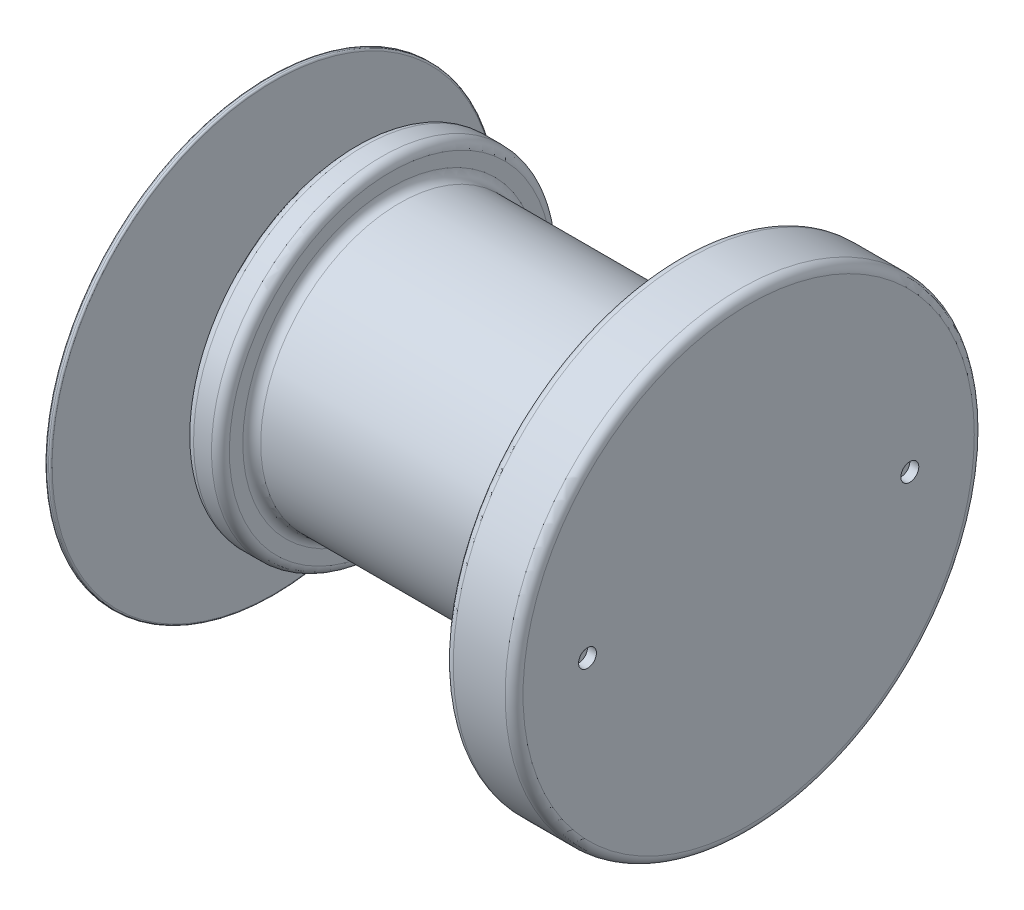
ISO-10303-21;
HEADER;
FILE_DESCRIPTION(('STEP AP214'),'2;1');
FILE_NAME('part.step','',(''),(''),'','','');
FILE_SCHEMA(('AUTOMOTIVE_DESIGN { 1 0 10303 214 1 1 1 1 }'));
ENDSEC;
DATA;
#1=APPLICATION_CONTEXT('core data for automotive mechanical design processes');
#2=APPLICATION_PROTOCOL_DEFINITION('international standard','automotive_design',2000,#1);
#3=PRODUCT_CONTEXT('',#1,'mechanical');
#4=PRODUCT('Part','Part','',(#3));
#5=PRODUCT_RELATED_PRODUCT_CATEGORY('part','',(#4));
#6=PRODUCT_DEFINITION_FORMATION('','',#4);
#7=PRODUCT_DEFINITION_CONTEXT('part definition',#1,'design');
#8=PRODUCT_DEFINITION('design','',#6,#7);
#9=PRODUCT_DEFINITION_SHAPE('','',#8);
#10=(LENGTH_UNIT() NAMED_UNIT(*) SI_UNIT(.MILLI.,.METRE.));
#11=(NAMED_UNIT(*) PLANE_ANGLE_UNIT() SI_UNIT($,.RADIAN.));
#12=(NAMED_UNIT(*) SI_UNIT($,.STERADIAN.) SOLID_ANGLE_UNIT());
#13=UNCERTAINTY_MEASURE_WITH_UNIT(LENGTH_MEASURE(1.E-05),#10,'distance_accuracy_value','');
#14=(GEOMETRIC_REPRESENTATION_CONTEXT(3) GLOBAL_UNCERTAINTY_ASSIGNED_CONTEXT((#13)) GLOBAL_UNIT_ASSIGNED_CONTEXT((#10,
#11,#12)) REPRESENTATION_CONTEXT('',''));
#15=CARTESIAN_POINT('',(0.,0.,0.));
#16=DIRECTION('',(0.,0.,1.));
#17=DIRECTION('',(1.,0.,0.));
#18=AXIS2_PLACEMENT_3D('',#15,#16,#17);
#19=CARTESIAN_POINT('',(-248.,-22.5,0.));
#20=DIRECTION('',(1.,0.,0.));
#21=DIRECTION('',(0.,1.,0.));
#22=AXIS2_PLACEMENT_3D('',#19,#20,#21);
#23=CYLINDRICAL_SURFACE('',#22,6.);
#24=CARTESIAN_POINT('',(-229.,-22.5,0.));
#25=DIRECTION('',(-1.,0.,0.));
#26=DIRECTION('',(0.,-1.,0.));
#27=AXIS2_PLACEMENT_3D('',#24,#25,#26);
#28=CIRCLE('',#27,6.);
#29=CARTESIAN_POINT('',(-229.,-28.5,0.));
#30=VERTEX_POINT('',#29);
#31=EDGE_CURVE('E103',#30,#30,#28,.T.);
#32=ORIENTED_EDGE('',*,*,#31,.T.);
#33=EDGE_LOOP('',(#32));
#34=FACE_BOUND('',#33,.T.);
#35=CARTESIAN_POINT('',(-238.,-22.5,0.));
#36=DIRECTION('',(-1.,0.,0.));
#37=DIRECTION('',(0.,-1.,0.));
#38=AXIS2_PLACEMENT_3D('',#35,#36,#37);
#39=CIRCLE('',#38,6.);
#40=CARTESIAN_POINT('',(-238.,-28.5,0.));
#41=VERTEX_POINT('',#40);
#42=EDGE_CURVE('E99',#41,#41,#39,.T.);
#43=ORIENTED_EDGE('',*,*,#42,.F.);
#44=EDGE_LOOP('',(#43));
#45=FACE_BOUND('',#44,.T.);
#46=ADVANCED_FACE('F31',(#34,#45),#23,.T.);
#47=CARTESIAN_POINT('',(-181.,0.,0.));
#48=DIRECTION('',(1.,0.,0.));
#49=DIRECTION('',(0.,1.,0.));
#50=AXIS2_PLACEMENT_3D('',#47,#48,#49);
#51=CYLINDRICAL_SURFACE('',#50,77.5);
#52=CARTESIAN_POINT('',(-156.,0.,0.));
#53=DIRECTION('',(-1.,0.,0.));
#54=DIRECTION('',(0.,-1.,0.));
#55=AXIS2_PLACEMENT_3D('',#52,#53,#54);
#56=CIRCLE('',#55,77.5);
#57=CARTESIAN_POINT('',(-156.,-77.5,0.));
#58=VERTEX_POINT('',#57);
#59=EDGE_CURVE('E46',#58,#58,#56,.F.);
#60=ORIENTED_EDGE('',*,*,#59,.T.);
#61=EDGE_LOOP('',(#60));
#62=FACE_BOUND('',#61,.T.);
#63=CARTESIAN_POINT('',(-5.,0.,0.));
#64=DIRECTION('',(1.,0.,0.));
#65=DIRECTION('',(0.,0.,-1.));
#66=AXIS2_PLACEMENT_3D('',#63,#64,#65);
#67=CIRCLE('',#66,77.5);
#68=CARTESIAN_POINT('',(-5.,0.,-77.5));
#69=VERTEX_POINT('',#68);
#70=EDGE_CURVE('E51',#69,#69,#67,.F.);
#71=ORIENTED_EDGE('',*,*,#70,.T.);
#72=EDGE_LOOP('',(#71));
#73=FACE_BOUND('',#72,.T.);
#74=ADVANCED_FACE('F159',(#62,#73),#51,.T.);
#75=CARTESIAN_POINT('',(0.,0.,0.));
#76=DIRECTION('',(1.,0.,0.));
#77=DIRECTION('',(0.,0.,-1.));
#78=AXIS2_PLACEMENT_3D('',#75,#76,#77);
#79=PLANE('',#78);
#80=CARTESIAN_POINT('',(0.,0.,0.));
#81=DIRECTION('',(1.,0.,0.));
#82=DIRECTION('',(0.,0.,-1.));
#83=AXIS2_PLACEMENT_3D('',#80,#81,#82);
#84=CIRCLE('',#83,126.);
#85=CARTESIAN_POINT('',(0.,0.,-126.));
#86=VERTEX_POINT('',#85);
#87=EDGE_CURVE('E60',#86,#86,#84,.F.);
#88=ORIENTED_EDGE('',*,*,#87,.T.);
#89=EDGE_LOOP('',(#88));
#90=FACE_BOUND('',#89,.T.);
#91=CARTESIAN_POINT('',(0.,0.,0.));
#92=DIRECTION('',(1.,0.,0.));
#93=DIRECTION('',(0.,0.,-1.));
#94=AXIS2_PLACEMENT_3D('',#91,#92,#93);
#95=CIRCLE('',#94,82.5);
#96=CARTESIAN_POINT('',(0.,0.,-82.5));
#97=VERTEX_POINT('',#96);
#98=EDGE_CURVE('E63',#97,#97,#95,.T.);
#99=ORIENTED_EDGE('',*,*,#98,.T.);
#100=EDGE_LOOP('',(#99));
#101=FACE_BOUND('',#100,.T.);
#102=ADVANCED_FACE('F165',(#90,#101),#79,.F.);
#103=CARTESIAN_POINT('',(39.,0.,0.));
#104=DIRECTION('',(-1.,0.,0.));
#105=DIRECTION('',(0.,0.,1.));
#106=AXIS2_PLACEMENT_3D('',#103,#104,#105);
#107=CYLINDRICAL_SURFACE('',#106,131.);
#108=CARTESIAN_POINT('',(34.,0.,0.));
#109=DIRECTION('',(1.,0.,0.));
#110=DIRECTION('',(0.,0.,-1.));
#111=AXIS2_PLACEMENT_3D('',#108,#109,#110);
#112=CIRCLE('',#111,131.);
#113=CARTESIAN_POINT('',(34.,0.,-131.));
#114=VERTEX_POINT('',#113);
#115=EDGE_CURVE('E66',#114,#114,#112,.F.);
#116=ORIENTED_EDGE('',*,*,#115,.T.);
#117=EDGE_LOOP('',(#116));
#118=FACE_BOUND('',#117,.T.);
#119=CARTESIAN_POINT('',(5.,0.,0.));
#120=DIRECTION('',(1.,0.,0.));
#121=DIRECTION('',(0.,0.,-1.));
#122=AXIS2_PLACEMENT_3D('',#119,#120,#121);
#123=CIRCLE('',#122,131.);
#124=CARTESIAN_POINT('',(5.,0.,-131.));
#125=VERTEX_POINT('',#124);
#126=EDGE_CURVE('E69',#125,#125,#123,.T.);
#127=ORIENTED_EDGE('',*,*,#126,.T.);
#128=EDGE_LOOP('',(#127));
#129=FACE_BOUND('',#128,.T.);
#130=ADVANCED_FACE('F137',(#118,#129),#107,.T.);
#131=CARTESIAN_POINT('',(39.,0.,0.));
#132=DIRECTION('',(1.,0.,0.));
#133=DIRECTION('',(0.,0.,-1.));
#134=AXIS2_PLACEMENT_3D('',#131,#132,#133);
#135=PLANE('',#134);
#136=CARTESIAN_POINT('',(39.,0.,0.));
#137=DIRECTION('',(1.,0.,0.));
#138=DIRECTION('',(0.,0.,-1.));
#139=AXIS2_PLACEMENT_3D('',#136,#137,#138);
#140=CIRCLE('',#139,126.);
#141=CARTESIAN_POINT('',(39.,0.,-126.));
#142=VERTEX_POINT('',#141);
#143=EDGE_CURVE('E72',#142,#142,#140,.T.);
#144=ORIENTED_EDGE('',*,*,#143,.T.);
#145=EDGE_LOOP('',(#144));
#146=FACE_BOUND('',#145,.T.);
#147=CARTESIAN_POINT('',(39.,0.,90.));
#148=DIRECTION('',(1.,0.,0.));
#149=DIRECTION('',(0.,1.,0.));
#150=AXIS2_PLACEMENT_3D('',#147,#148,#149);
#151=CIRCLE('',#150,5.00000000000001);
#152=CARTESIAN_POINT('',(39.,5.00000000000001,90.));
#153=VERTEX_POINT('',#152);
#154=EDGE_CURVE('E118',#153,#153,#151,.T.);
#155=ORIENTED_EDGE('',*,*,#154,.F.);
#156=EDGE_LOOP('',(#155));
#157=FACE_BOUND('',#156,.T.);
#158=CARTESIAN_POINT('',(39.,0.,-90.));
#159=DIRECTION('',(1.,0.,0.));
#160=DIRECTION('',(0.,1.,0.));
#161=AXIS2_PLACEMENT_3D('',#158,#159,#160);
#162=CIRCLE('',#161,5.);
#163=CARTESIAN_POINT('',(39.,5.,-90.));
#164=VERTEX_POINT('',#163);
#165=EDGE_CURVE('E112',#164,#164,#162,.T.);
#166=ORIENTED_EDGE('',*,*,#165,.F.);
#167=EDGE_LOOP('',(#166));
#168=FACE_BOUND('',#167,.T.);
#169=ADVANCED_FACE('F133',(#146,#157,#168),#135,.T.);
#170=CARTESIAN_POINT('',(-161.,0.,0.));
#171=DIRECTION('',(-1.,0.,0.));
#172=DIRECTION('',(0.,-1.,0.));
#173=AXIS2_PLACEMENT_3D('',#170,#171,#172);
#174=PLANE('',#173);
#175=CARTESIAN_POINT('',(-161.,0.,0.));
#176=DIRECTION('',(-1.,0.,0.));
#177=DIRECTION('',(0.,-1.,0.));
#178=AXIS2_PLACEMENT_3D('',#175,#176,#177);
#179=CIRCLE('',#178,82.5);
#180=CARTESIAN_POINT('',(-161.,-82.5,0.));
#181=VERTEX_POINT('',#180);
#182=EDGE_CURVE('E54',#181,#181,#179,.T.);
#183=ORIENTED_EDGE('',*,*,#182,.T.);
#184=EDGE_LOOP('',(#183));
#185=FACE_BOUND('',#184,.T.);
#186=CARTESIAN_POINT('',(-161.,0.,0.));
#187=DIRECTION('',(-1.,0.,0.));
#188=DIRECTION('',(0.,-1.,0.));
#189=AXIS2_PLACEMENT_3D('',#186,#187,#188);
#190=CIRCLE('',#189,90.);
#191=CARTESIAN_POINT('',(-161.,-90.,0.));
#192=VERTEX_POINT('',#191);
#193=EDGE_CURVE('E57',#192,#192,#190,.F.);
#194=ORIENTED_EDGE('',*,*,#193,.T.);
#195=EDGE_LOOP('',(#194));
#196=FACE_BOUND('',#195,.T.);
#197=ADVANCED_FACE('F136',(#185,#196),#174,.F.);
#198=CARTESIAN_POINT('',(-161.,0.,0.));
#199=DIRECTION('',(-1.,0.,0.));
#200=DIRECTION('',(0.,-1.,0.));
#201=AXIS2_PLACEMENT_3D('',#198,#199,#200);
#202=CYLINDRICAL_SURFACE('',#201,95.);
#203=CARTESIAN_POINT('',(-166.,0.,0.));
#204=DIRECTION('',(-1.,0.,0.));
#205=DIRECTION('',(0.,-1.,0.));
#206=AXIS2_PLACEMENT_3D('',#203,#204,#205);
#207=CIRCLE('',#206,95.);
#208=CARTESIAN_POINT('',(-166.,-95.,0.));
#209=VERTEX_POINT('',#208);
#210=EDGE_CURVE('E38',#209,#209,#207,.T.);
#211=ORIENTED_EDGE('',*,*,#210,.T.);
#212=EDGE_LOOP('',(#211));
#213=FACE_BOUND('',#212,.T.);
#214=CARTESIAN_POINT('',(-176.,0.,0.));
#215=DIRECTION('',(-1.,0.,0.));
#216=DIRECTION('',(0.,-1.,0.));
#217=AXIS2_PLACEMENT_3D('',#214,#215,#216);
#218=CIRCLE('',#217,95.);
#219=CARTESIAN_POINT('',(-176.,-95.,0.));
#220=VERTEX_POINT('',#219);
#221=EDGE_CURVE('E42',#220,#220,#218,.F.);
#222=ORIENTED_EDGE('',*,*,#221,.T.);
#223=EDGE_LOOP('',(#222));
#224=FACE_BOUND('',#223,.T.);
#225=ADVANCED_FACE('F173',(#213,#224),#202,.T.);
#226=CARTESIAN_POINT('',(-226.,-22.5,0.));
#227=DIRECTION('',(1.,0.,0.));
#228=DIRECTION('',(0.,1.,0.));
#229=AXIS2_PLACEMENT_3D('',#226,#227,#228);
#230=CYLINDRICAL_SURFACE('',#229,20.);
#231=CARTESIAN_POINT('',(-226.,-22.5,0.));
#232=DIRECTION('',(-1.,0.,0.));
#233=DIRECTION('',(0.,-1.,0.));
#234=AXIS2_PLACEMENT_3D('',#231,#232,#233);
#235=CIRCLE('',#234,20.);
#236=CARTESIAN_POINT('',(-226.,-2.50000000000002,0.));
#237=VERTEX_POINT('',#236);
#238=EDGE_CURVE('E102',#237,#237,#235,.T.);
#239=CARTESIAN_POINT('',(-181.,-22.5,0.));
#240=DIRECTION('',(-1.,0.,0.));
#241=DIRECTION('',(0.,-1.,0.));
#242=AXIS2_PLACEMENT_3D('',#239,#240,#241);
#243=CIRCLE('',#242,20.);
#244=CARTESIAN_POINT('',(-181.,-2.50000000000001,0.));
#245=VERTEX_POINT('',#244);
#246=EDGE_CURVE('E106',#245,#245,#243,.T.);
#247=CARTESIAN_POINT('',(-226.,-2.50000000000002,0.));
#248=CARTESIAN_POINT('',(-225.53125,-2.50000000000002,0.));
#249=CARTESIAN_POINT('',(-225.0625,-2.50000000000002,0.));
#250=CARTESIAN_POINT('',(-224.125,-2.50000000000002,0.));
#251=CARTESIAN_POINT('',(-223.65625,-2.50000000000002,0.));
#252=CARTESIAN_POINT('',(-222.71875,-2.50000000000002,0.));
#253=CARTESIAN_POINT('',(-222.25,-2.50000000000002,0.));
#254=CARTESIAN_POINT('',(-221.3125,-2.50000000000002,0.));
#255=CARTESIAN_POINT('',(-220.84375,-2.50000000000002,0.));
#256=CARTESIAN_POINT('',(-219.90625,-2.50000000000002,0.));
#257=CARTESIAN_POINT('',(-219.4375,-2.50000000000002,0.));
#258=CARTESIAN_POINT('',(-218.5,-2.50000000000002,0.));
#259=CARTESIAN_POINT('',(-218.03125,-2.50000000000002,0.));
#260=CARTESIAN_POINT('',(-217.09375,-2.50000000000002,0.));
#261=CARTESIAN_POINT('',(-216.625,-2.50000000000002,0.));
#262=CARTESIAN_POINT('',(-215.6875,-2.50000000000002,0.));
#263=CARTESIAN_POINT('',(-215.21875,-2.50000000000002,0.));
#264=CARTESIAN_POINT('',(-214.28125,-2.50000000000002,0.));
#265=CARTESIAN_POINT('',(-213.8125,-2.50000000000002,0.));
#266=CARTESIAN_POINT('',(-212.875,-2.50000000000002,0.));
#267=CARTESIAN_POINT('',(-212.40625,-2.50000000000002,0.));
#268=CARTESIAN_POINT('',(-211.46875,-2.50000000000002,0.));
#269=CARTESIAN_POINT('',(-211.,-2.50000000000002,0.));
#270=CARTESIAN_POINT('',(-210.0625,-2.50000000000002,0.));
#271=CARTESIAN_POINT('',(-209.59375,-2.50000000000002,0.));
#272=CARTESIAN_POINT('',(-208.65625,-2.50000000000002,0.));
#273=CARTESIAN_POINT('',(-208.1875,-2.50000000000001,0.));
#274=CARTESIAN_POINT('',(-207.25,-2.50000000000001,0.));
#275=CARTESIAN_POINT('',(-206.78125,-2.50000000000001,0.));
#276=CARTESIAN_POINT('',(-205.84375,-2.50000000000001,0.));
#277=CARTESIAN_POINT('',(-205.375,-2.50000000000001,0.));
#278=CARTESIAN_POINT('',(-204.4375,-2.50000000000001,0.));
#279=CARTESIAN_POINT('',(-203.96875,-2.50000000000001,0.));
#280=CARTESIAN_POINT('',(-203.03125,-2.50000000000001,0.));
#281=CARTESIAN_POINT('',(-202.5625,-2.50000000000001,0.));
#282=CARTESIAN_POINT('',(-201.625,-2.50000000000001,0.));
#283=CARTESIAN_POINT('',(-201.15625,-2.50000000000001,0.));
#284=CARTESIAN_POINT('',(-200.21875,-2.50000000000001,0.));
#285=CARTESIAN_POINT('',(-199.75,-2.50000000000001,0.));
#286=CARTESIAN_POINT('',(-198.8125,-2.50000000000001,0.));
#287=CARTESIAN_POINT('',(-198.34375,-2.50000000000001,0.));
#288=CARTESIAN_POINT('',(-197.40625,-2.50000000000001,0.));
#289=CARTESIAN_POINT('',(-196.9375,-2.50000000000001,0.));
#290=CARTESIAN_POINT('',(-196.,-2.50000000000001,0.));
#291=CARTESIAN_POINT('',(-195.53125,-2.50000000000001,0.));
#292=CARTESIAN_POINT('',(-194.59375,-2.50000000000001,0.));
#293=CARTESIAN_POINT('',(-194.125,-2.50000000000001,0.));
#294=CARTESIAN_POINT('',(-193.1875,-2.50000000000001,0.));
#295=CARTESIAN_POINT('',(-192.71875,-2.50000000000001,0.));
#296=CARTESIAN_POINT('',(-191.78125,-2.50000000000001,0.));
#297=CARTESIAN_POINT('',(-191.3125,-2.50000000000001,0.));
#298=CARTESIAN_POINT('',(-190.375,-2.50000000000001,0.));
#299=CARTESIAN_POINT('',(-189.90625,-2.50000000000001,0.));
#300=CARTESIAN_POINT('',(-188.96875,-2.50000000000001,0.));
#301=CARTESIAN_POINT('',(-188.5,-2.50000000000001,0.));
#302=CARTESIAN_POINT('',(-187.5625,-2.50000000000001,0.));
#303=CARTESIAN_POINT('',(-187.09375,-2.50000000000001,0.));
#304=CARTESIAN_POINT('',(-186.15625,-2.50000000000001,0.));
#305=CARTESIAN_POINT('',(-185.6875,-2.50000000000001,0.));
#306=CARTESIAN_POINT('',(-184.75,-2.50000000000001,0.));
#307=CARTESIAN_POINT('',(-184.28125,-2.50000000000001,0.));
#308=CARTESIAN_POINT('',(-183.34375,-2.50000000000001,0.));
#309=CARTESIAN_POINT('',(-182.875,-2.50000000000001,0.));
#310=CARTESIAN_POINT('',(-181.9375,-2.50000000000001,0.));
#311=CARTESIAN_POINT('',(-181.46875,-2.50000000000001,0.));
#312=CARTESIAN_POINT('',(-181.,-2.50000000000001,0.));
#313=B_SPLINE_CURVE_WITH_KNOTS('',3,(#247,#248,#249,#250,#251,#252,#253,#254,#255,#256,#257,
#258,#259,#260,#261,#262,#263,#264,#265,#266,#267,#268,#269,#270,#271,#272,#273,#274,#275,#276,
#277,#278,#279,#280,#281,#282,#283,#284,#285,#286,#287,#288,#289,#290,#291,#292,#293,#294,#295,
#296,#297,#298,#299,#300,#301,#302,#303,#304,#305,#306,#307,#308,#309,#310,#311,#312),
.UNSPECIFIED.,.F.,.F.,(4,2,2,2,2,2,2,2,2,2,2,2,2,2,2,2,2,2,2,2,2,2,2,2,2,2,2,2,2,2,2,2,4),(0.,
1.40625000000003,2.81250000000002,4.21875000000002,5.62500000000002,7.03125000000002,
8.43750000000001,9.84375000000001,11.25,12.65625,14.0625,15.46875,16.875,18.28125,19.6875,
21.09375,22.5,23.90625,25.3125,26.71875,28.125,29.53125,30.9375,32.34375,33.75,35.15625,36.5625,
37.96875,39.375,40.78125,42.1875,43.59375,45.),.UNSPECIFIED.);
#314=EDGE_CURVE('BSEAM177',#237,#245,#313,.T.);
#315=ORIENTED_EDGE('',*,*,#238,.F.);
#316=ORIENTED_EDGE('',*,*,#246,.T.);
#317=ORIENTED_EDGE('',*,*,#314,.T.);
#318=ORIENTED_EDGE('',*,*,#314,.F.);
#319=EDGE_LOOP('',(#315,#317,#316,#318));
#320=FACE_BOUND('',#319,.T.);
#321=ADVANCED_FACE('F177',(#320),#230,.T.);
#322=CARTESIAN_POINT('',(-181.,0.,0.));
#323=DIRECTION('',(-1.,0.,0.));
#324=DIRECTION('',(0.,-1.,0.));
#325=AXIS2_PLACEMENT_3D('',#322,#323,#324);
#326=PLANE('',#325);
#327=CARTESIAN_POINT('',(-181.,0.,0.));
#328=DIRECTION('',(-1.,0.,0.));
#329=DIRECTION('',(0.,-1.,0.));
#330=AXIS2_PLACEMENT_3D('',#327,#328,#329);
#331=CIRCLE('',#330,90.);
#332=CARTESIAN_POINT('',(-181.,-90.,0.));
#333=VERTEX_POINT('',#332);
#334=EDGE_CURVE('E10',#333,#333,#331,.T.);
#335=ORIENTED_EDGE('',*,*,#334,.T.);
#336=EDGE_LOOP('',(#335));
#337=FACE_BOUND('',#336,.T.);
#338=ORIENTED_EDGE('',*,*,#246,.F.);
#339=EDGE_LOOP('',(#338));
#340=FACE_BOUND('',#339,.T.);
#341=ADVANCED_FACE('F180',(#337,#340),#326,.T.);
#342=CARTESIAN_POINT('',(-229.,-22.5,0.));
#343=DIRECTION('',(-1.,0.,0.));
#344=DIRECTION('',(0.,-1.,0.));
#345=AXIS2_PLACEMENT_3D('',#342,#343,#344);
#346=PLANE('',#345);
#347=CARTESIAN_POINT('',(-229.,-22.5,0.));
#348=DIRECTION('',(-1.,0.,0.));
#349=DIRECTION('',(0.,-1.,0.));
#350=AXIS2_PLACEMENT_3D('',#347,#348,#349);
#351=CIRCLE('',#350,124.);
#352=CARTESIAN_POINT('',(-229.,-146.5,0.));
#353=VERTEX_POINT('',#352);
#354=EDGE_CURVE('E84',#353,#353,#351,.T.);
#355=ORIENTED_EDGE('',*,*,#354,.T.);
#356=EDGE_LOOP('',(#355));
#357=FACE_BOUND('',#356,.T.);
#358=ORIENTED_EDGE('',*,*,#31,.F.);
#359=EDGE_LOOP('',(#358));
#360=FACE_BOUND('',#359,.T.);
#361=ADVANCED_FACE('F183',(#357,#360),#346,.T.);
#362=CARTESIAN_POINT('',(-226.,-22.5,0.));
#363=DIRECTION('',(-1.,0.,0.));
#364=DIRECTION('',(0.,-1.,0.));
#365=AXIS2_PLACEMENT_3D('',#362,#363,#364);
#366=PLANE('',#365);
#367=CARTESIAN_POINT('',(-226.,-22.5,0.));
#368=DIRECTION('',(-1.,0.,0.));
#369=DIRECTION('',(0.,-1.,0.));
#370=AXIS2_PLACEMENT_3D('',#367,#368,#369);
#371=CIRCLE('',#370,124.);
#372=CARTESIAN_POINT('',(-226.,-146.5,0.));
#373=VERTEX_POINT('',#372);
#374=EDGE_CURVE('E75',#373,#373,#371,.F.);
#375=ORIENTED_EDGE('',*,*,#374,.T.);
#376=EDGE_LOOP('',(#375));
#377=FACE_BOUND('',#376,.T.);
#378=ORIENTED_EDGE('',*,*,#238,.T.);
#379=EDGE_LOOP('',(#378));
#380=FACE_BOUND('',#379,.T.);
#381=ADVANCED_FACE('F334',(#377,#380),#366,.F.);
#382=CARTESIAN_POINT('',(-229.,-22.5,0.));
#383=DIRECTION('',(1.,0.,0.));
#384=DIRECTION('',(0.,1.,0.));
#385=AXIS2_PLACEMENT_3D('',#382,#383,#384);
#386=CYLINDRICAL_SURFACE('',#385,125.);
#387=CARTESIAN_POINT('',(-228.,-22.5,0.));
#388=DIRECTION('',(-1.,0.,0.));
#389=DIRECTION('',(0.,-1.,0.));
#390=AXIS2_PLACEMENT_3D('',#387,#388,#389);
#391=CIRCLE('',#390,125.);
#392=CARTESIAN_POINT('',(-228.,-147.5,0.));
#393=VERTEX_POINT('',#392);
#394=EDGE_CURVE('E78',#393,#393,#391,.F.);
#395=ORIENTED_EDGE('',*,*,#394,.T.);
#396=EDGE_LOOP('',(#395));
#397=FACE_BOUND('',#396,.T.);
#398=CARTESIAN_POINT('',(-227.,-22.5,0.));
#399=DIRECTION('',(-1.,0.,0.));
#400=DIRECTION('',(0.,-1.,0.));
#401=AXIS2_PLACEMENT_3D('',#398,#399,#400);
#402=CIRCLE('',#401,125.);
#403=CARTESIAN_POINT('',(-227.,-147.5,0.));
#404=VERTEX_POINT('',#403);
#405=EDGE_CURVE('E81',#404,#404,#402,.T.);
#406=ORIENTED_EDGE('',*,*,#405,.T.);
#407=EDGE_LOOP('',(#406));
#408=FACE_BOUND('',#407,.T.);
#409=ADVANCED_FACE('F328',(#397,#408),#386,.T.);
#410=CARTESIAN_POINT('',(-238.,-22.5,0.));
#411=DIRECTION('',(-1.,0.,0.));
#412=DIRECTION('',(0.,-1.,0.));
#413=AXIS2_PLACEMENT_3D('',#410,#411,#412);
#414=PLANE('',#413);
#415=CARTESIAN_POINT('',(-238.,-22.5,0.));
#416=DIRECTION('',(-1.,0.,0.));
#417=DIRECTION('',(0.,-1.,0.));
#418=AXIS2_PLACEMENT_3D('',#415,#416,#417);
#419=CIRCLE('',#418,13.);
#420=CARTESIAN_POINT('',(-238.,-35.5,0.));
#421=VERTEX_POINT('',#420);
#422=EDGE_CURVE('E90',#421,#421,#419,.F.);
#423=ORIENTED_EDGE('',*,*,#422,.T.);
#424=EDGE_LOOP('',(#423));
#425=FACE_BOUND('',#424,.T.);
#426=ORIENTED_EDGE('',*,*,#42,.T.);
#427=EDGE_LOOP('',(#426));
#428=FACE_BOUND('',#427,.T.);
#429=ADVANCED_FACE('F333',(#425,#428),#414,.F.);
#430=CARTESIAN_POINT('',(-238.,-22.5,0.));
#431=DIRECTION('',(-1.,0.,0.));
#432=DIRECTION('',(0.,-1.,0.));
#433=AXIS2_PLACEMENT_3D('',#430,#431,#432);
#434=CYLINDRICAL_SURFACE('',#433,14.);
#435=CARTESIAN_POINT('',(-239.,-22.5,0.));
#436=DIRECTION('',(-1.,0.,0.));
#437=DIRECTION('',(0.,-1.,0.));
#438=AXIS2_PLACEMENT_3D('',#435,#436,#437);
#439=CIRCLE('',#438,14.);
#440=CARTESIAN_POINT('',(-239.,-36.5,0.));
#441=VERTEX_POINT('',#440);
#442=EDGE_CURVE('E93',#441,#441,#439,.T.);
#443=ORIENTED_EDGE('',*,*,#442,.T.);
#444=EDGE_LOOP('',(#443));
#445=FACE_BOUND('',#444,.T.);
#446=CARTESIAN_POINT('',(-247.,-22.5,0.));
#447=DIRECTION('',(-1.,0.,0.));
#448=DIRECTION('',(0.,-1.,0.));
#449=AXIS2_PLACEMENT_3D('',#446,#447,#448);
#450=CIRCLE('',#449,14.);
#451=CARTESIAN_POINT('',(-247.,-36.5,0.));
#452=VERTEX_POINT('',#451);
#453=EDGE_CURVE('E96',#452,#452,#450,.F.);
#454=ORIENTED_EDGE('',*,*,#453,.T.);
#455=EDGE_LOOP('',(#454));
#456=FACE_BOUND('',#455,.T.);
#457=ADVANCED_FACE('F153',(#445,#456),#434,.T.);
#458=CARTESIAN_POINT('',(-248.,-22.5,0.));
#459=DIRECTION('',(-1.,0.,0.));
#460=DIRECTION('',(0.,-1.,0.));
#461=AXIS2_PLACEMENT_3D('',#458,#459,#460);
#462=PLANE('',#461);
#463=CARTESIAN_POINT('',(-248.,-22.5,0.));
#464=DIRECTION('',(-1.,0.,0.));
#465=DIRECTION('',(0.,-1.,0.));
#466=AXIS2_PLACEMENT_3D('',#463,#464,#465);
#467=CIRCLE('',#466,13.);
#468=CARTESIAN_POINT('',(-248.,-35.5,0.));
#469=VERTEX_POINT('',#468);
#470=EDGE_CURVE('E87',#469,#469,#467,.T.);
#471=ORIENTED_EDGE('',*,*,#470,.T.);
#472=EDGE_LOOP('',(#471));
#473=FACE_BOUND('',#472,.T.);
#474=ADVANCED_FACE('F144',(#473),#462,.T.);
#475=CARTESIAN_POINT('',(34.,0.,-90.));
#476=DIRECTION('',(1.,0.,0.));
#477=DIRECTION('',(0.,1.,0.));
#478=AXIS2_PLACEMENT_3D('',#475,#476,#477);
#479=CYLINDRICAL_SURFACE('',#478,5.);
#480=CARTESIAN_POINT('',(34.,0.,-90.));
#481=DIRECTION('',(1.,0.,0.));
#482=DIRECTION('',(0.,1.,0.));
#483=AXIS2_PLACEMENT_3D('',#480,#481,#482);
#484=CIRCLE('',#483,5.);
#485=CARTESIAN_POINT('',(34.,5.,-90.));
#486=VERTEX_POINT('',#485);
#487=EDGE_CURVE('E107',#486,#486,#484,.T.);
#488=ORIENTED_EDGE('',*,*,#487,.F.);
#489=EDGE_LOOP('',(#488));
#490=FACE_BOUND('',#489,.T.);
#491=ORIENTED_EDGE('',*,*,#165,.T.);
#492=EDGE_LOOP('',(#491));
#493=FACE_BOUND('',#492,.T.);
#494=ADVANCED_FACE('F142',(#490,#493),#479,.F.);
#495=CARTESIAN_POINT('',(34.,0.,-90.));
#496=DIRECTION('',(1.,0.,0.));
#497=DIRECTION('',(0.,1.,0.));
#498=AXIS2_PLACEMENT_3D('',#495,#496,#497);
#499=PLANE('',#498);
#500=ORIENTED_EDGE('',*,*,#487,.T.);
#501=EDGE_LOOP('',(#500));
#502=FACE_BOUND('',#501,.T.);
#503=ADVANCED_FACE('F129',(#502),#499,.T.);
#504=CARTESIAN_POINT('',(34.,0.,90.));
#505=DIRECTION('',(1.,0.,0.));
#506=DIRECTION('',(0.,1.,0.));
#507=AXIS2_PLACEMENT_3D('',#504,#505,#506);
#508=CYLINDRICAL_SURFACE('',#507,5.00000000000001);
#509=CARTESIAN_POINT('',(34.,0.,90.));
#510=DIRECTION('',(1.,0.,0.));
#511=DIRECTION('',(0.,1.,0.));
#512=AXIS2_PLACEMENT_3D('',#509,#510,#511);
#513=CIRCLE('',#512,5.00000000000001);
#514=CARTESIAN_POINT('',(34.,5.00000000000001,90.));
#515=VERTEX_POINT('',#514);
#516=EDGE_CURVE('E115',#515,#515,#513,.T.);
#517=ORIENTED_EDGE('',*,*,#516,.F.);
#518=EDGE_LOOP('',(#517));
#519=FACE_BOUND('',#518,.T.);
#520=ORIENTED_EDGE('',*,*,#154,.T.);
#521=EDGE_LOOP('',(#520));
#522=FACE_BOUND('',#521,.T.);
#523=ADVANCED_FACE('F126',(#519,#522),#508,.F.);
#524=CARTESIAN_POINT('',(34.,0.,90.));
#525=DIRECTION('',(1.,0.,0.));
#526=DIRECTION('',(0.,1.,0.));
#527=AXIS2_PLACEMENT_3D('',#524,#525,#526);
#528=PLANE('',#527);
#529=ORIENTED_EDGE('',*,*,#516,.T.);
#530=EDGE_LOOP('',(#529));
#531=FACE_BOUND('',#530,.T.);
#532=ADVANCED_FACE('F124',(#531),#528,.T.);
#533=CARTESIAN_POINT('',(-239.,-22.5,0.));
#534=DIRECTION('',(-1.,0.,0.));
#535=DIRECTION('',(0.,-1.,0.));
#536=AXIS2_PLACEMENT_3D('',#533,#534,#535);
#537=TOROIDAL_SURFACE('',#536,13.,1.);
#538=ORIENTED_EDGE('',*,*,#422,.F.);
#539=EDGE_LOOP('',(#538));
#540=FACE_BOUND('',#539,.T.);
#541=ORIENTED_EDGE('',*,*,#442,.F.);
#542=EDGE_LOOP('',(#541));
#543=FACE_BOUND('',#542,.T.);
#544=ADVANCED_FACE('F191',(#540,#543),#537,.T.);
#545=CARTESIAN_POINT('',(-247.,-22.5,0.));
#546=DIRECTION('',(-1.,0.,0.));
#547=DIRECTION('',(0.,-1.,0.));
#548=AXIS2_PLACEMENT_3D('',#545,#546,#547);
#549=TOROIDAL_SURFACE('',#548,13.,1.);
#550=ORIENTED_EDGE('',*,*,#453,.F.);
#551=EDGE_LOOP('',(#550));
#552=FACE_BOUND('',#551,.T.);
#553=ORIENTED_EDGE('',*,*,#470,.F.);
#554=EDGE_LOOP('',(#553));
#555=FACE_BOUND('',#554,.T.);
#556=ADVANCED_FACE('F194',(#552,#555),#549,.T.);
#557=CARTESIAN_POINT('',(-228.,-22.5,0.));
#558=DIRECTION('',(-1.,0.,0.));
#559=DIRECTION('',(0.,-1.,0.));
#560=AXIS2_PLACEMENT_3D('',#557,#558,#559);
#561=TOROIDAL_SURFACE('',#560,124.,1.);
#562=ORIENTED_EDGE('',*,*,#394,.F.);
#563=EDGE_LOOP('',(#562));
#564=FACE_BOUND('',#563,.T.);
#565=ORIENTED_EDGE('',*,*,#354,.F.);
#566=EDGE_LOOP('',(#565));
#567=FACE_BOUND('',#566,.T.);
#568=ADVANCED_FACE('F198',(#564,#567),#561,.T.);
#569=CARTESIAN_POINT('',(-227.,-22.5,0.));
#570=DIRECTION('',(-1.,0.,0.));
#571=DIRECTION('',(0.,-1.,0.));
#572=AXIS2_PLACEMENT_3D('',#569,#570,#571);
#573=TOROIDAL_SURFACE('',#572,124.,1.);
#574=ORIENTED_EDGE('',*,*,#374,.F.);
#575=EDGE_LOOP('',(#574));
#576=FACE_BOUND('',#575,.T.);
#577=ORIENTED_EDGE('',*,*,#405,.F.);
#578=EDGE_LOOP('',(#577));
#579=FACE_BOUND('',#578,.T.);
#580=ADVANCED_FACE('F202',(#576,#579),#573,.T.);
#581=CARTESIAN_POINT('',(34.,0.,0.));
#582=DIRECTION('',(1.,0.,0.));
#583=DIRECTION('',(0.,0.,-1.));
#584=AXIS2_PLACEMENT_3D('',#581,#582,#583);
#585=TOROIDAL_SURFACE('',#584,126.,5.);
#586=ORIENTED_EDGE('',*,*,#115,.F.);
#587=EDGE_LOOP('',(#586));
#588=FACE_BOUND('',#587,.T.);
#589=ORIENTED_EDGE('',*,*,#143,.F.);
#590=EDGE_LOOP('',(#589));
#591=FACE_BOUND('',#590,.T.);
#592=ADVANCED_FACE('F206',(#588,#591),#585,.T.);
#593=CARTESIAN_POINT('',(5.,0.,0.));
#594=DIRECTION('',(1.,0.,0.));
#595=DIRECTION('',(0.,0.,-1.));
#596=AXIS2_PLACEMENT_3D('',#593,#594,#595);
#597=TOROIDAL_SURFACE('',#596,126.,5.);
#598=ORIENTED_EDGE('',*,*,#87,.F.);
#599=EDGE_LOOP('',(#598));
#600=FACE_BOUND('',#599,.T.);
#601=ORIENTED_EDGE('',*,*,#126,.F.);
#602=EDGE_LOOP('',(#601));
#603=FACE_BOUND('',#602,.T.);
#604=ADVANCED_FACE('F210',(#600,#603),#597,.T.);
#605=CARTESIAN_POINT('',(-156.,0.,0.));
#606=DIRECTION('',(-1.,0.,0.));
#607=DIRECTION('',(0.,-1.,0.));
#608=AXIS2_PLACEMENT_3D('',#605,#606,#607);
#609=TOROIDAL_SURFACE('',#608,82.5,5.);
#610=ORIENTED_EDGE('',*,*,#59,.F.);
#611=EDGE_LOOP('',(#610));
#612=FACE_BOUND('',#611,.T.);
#613=ORIENTED_EDGE('',*,*,#182,.F.);
#614=EDGE_LOOP('',(#613));
#615=FACE_BOUND('',#614,.T.);
#616=ADVANCED_FACE('F214',(#612,#615),#609,.F.);
#617=CARTESIAN_POINT('',(-5.,0.,0.));
#618=DIRECTION('',(1.,0.,0.));
#619=DIRECTION('',(0.,0.,-1.));
#620=AXIS2_PLACEMENT_3D('',#617,#618,#619);
#621=TOROIDAL_SURFACE('',#620,82.5,5.);
#622=ORIENTED_EDGE('',*,*,#98,.F.);
#623=EDGE_LOOP('',(#622));
#624=FACE_BOUND('',#623,.T.);
#625=ORIENTED_EDGE('',*,*,#70,.F.);
#626=EDGE_LOOP('',(#625));
#627=FACE_BOUND('',#626,.T.);
#628=ADVANCED_FACE('F218',(#624,#627),#621,.F.);
#629=CARTESIAN_POINT('',(-166.,0.,0.));
#630=DIRECTION('',(-1.,0.,0.));
#631=DIRECTION('',(0.,-1.,0.));
#632=AXIS2_PLACEMENT_3D('',#629,#630,#631);
#633=TOROIDAL_SURFACE('',#632,90.,5.);
#634=ORIENTED_EDGE('',*,*,#193,.F.);
#635=EDGE_LOOP('',(#634));
#636=FACE_BOUND('',#635,.T.);
#637=ORIENTED_EDGE('',*,*,#210,.F.);
#638=EDGE_LOOP('',(#637));
#639=FACE_BOUND('',#638,.T.);
#640=ADVANCED_FACE('F221',(#636,#639),#633,.T.);
#641=CARTESIAN_POINT('',(-176.,0.,0.));
#642=DIRECTION('',(-1.,0.,0.));
#643=DIRECTION('',(0.,-1.,0.));
#644=AXIS2_PLACEMENT_3D('',#641,#642,#643);
#645=TOROIDAL_SURFACE('',#644,90.,5.);
#646=ORIENTED_EDGE('',*,*,#221,.F.);
#647=EDGE_LOOP('',(#646));
#648=FACE_BOUND('',#647,.T.);
#649=ORIENTED_EDGE('',*,*,#334,.F.);
#650=EDGE_LOOP('',(#649));
#651=FACE_BOUND('',#650,.T.);
#652=ADVANCED_FACE('F33',(#648,#651),#645,.T.);
#653=CLOSED_SHELL('',(#46,#74,#102,#130,#169,#197,#225,#321,#341,#361,#381,#409,#429,#457,#474,
#494,#503,#523,#532,#544,#556,#568,#580,#592,#604,#616,#628,#640,#652));
#654=MANIFOLD_SOLID_BREP('B2',#653);
#655=ADVANCED_BREP_SHAPE_REPRESENTATION('',(#18,#654),#14);
#656=SHAPE_DEFINITION_REPRESENTATION(#9,#655);
ENDSEC;
END-ISO-10303-21;
